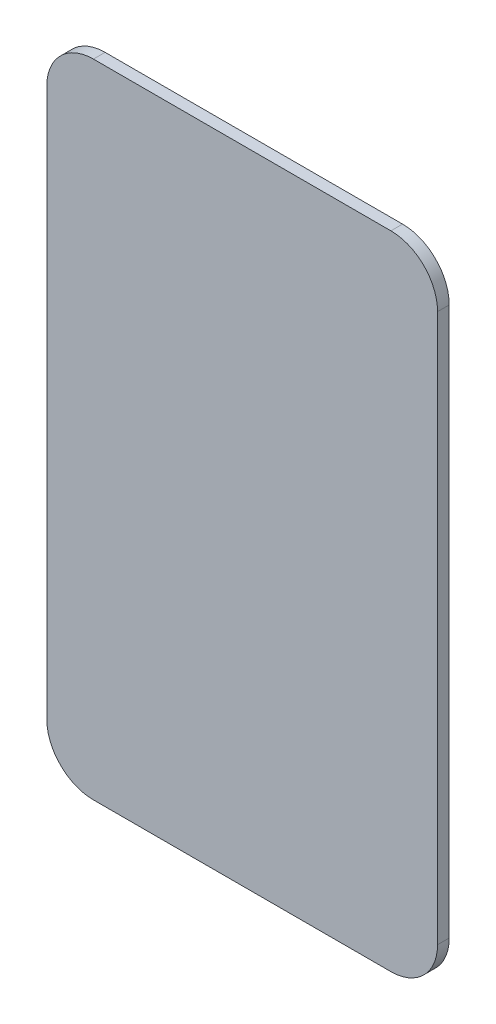
ISO-10303-21;
HEADER;
FILE_DESCRIPTION(('STEP AP214'),'2;1');
FILE_NAME('part.step','',(''),(''),'','','');
FILE_SCHEMA(('AUTOMOTIVE_DESIGN { 1 0 10303 214 1 1 1 1 }'));
ENDSEC;
DATA;
#1=APPLICATION_CONTEXT('core data for automotive mechanical design processes');
#2=APPLICATION_PROTOCOL_DEFINITION('international standard','automotive_design',2000,#1);
#3=PRODUCT_CONTEXT('',#1,'mechanical');
#4=PRODUCT('Part','Part','',(#3));
#5=PRODUCT_RELATED_PRODUCT_CATEGORY('part','',(#4));
#6=PRODUCT_DEFINITION_FORMATION('','',#4);
#7=PRODUCT_DEFINITION_CONTEXT('part definition',#1,'design');
#8=PRODUCT_DEFINITION('design','',#6,#7);
#9=PRODUCT_DEFINITION_SHAPE('','',#8);
#10=(LENGTH_UNIT() NAMED_UNIT(*) SI_UNIT(.MILLI.,.METRE.));
#11=(NAMED_UNIT(*) PLANE_ANGLE_UNIT() SI_UNIT($,.RADIAN.));
#12=(NAMED_UNIT(*) SI_UNIT($,.STERADIAN.) SOLID_ANGLE_UNIT());
#13=UNCERTAINTY_MEASURE_WITH_UNIT(LENGTH_MEASURE(1.E-05),#10,'distance_accuracy_value','');
#14=(GEOMETRIC_REPRESENTATION_CONTEXT(3) GLOBAL_UNCERTAINTY_ASSIGNED_CONTEXT((#13)) GLOBAL_UNIT_ASSIGNED_CONTEXT((#10,
#11,#12)) REPRESENTATION_CONTEXT('',''));
#15=CARTESIAN_POINT('',(0.,0.,0.));
#16=DIRECTION('',(0.,0.,1.));
#17=DIRECTION('',(1.,0.,0.));
#18=AXIS2_PLACEMENT_3D('',#15,#16,#17);
#19=CARTESIAN_POINT('',(812.8,1358.9,25.4));
#20=DIRECTION('',(0.,0.,-1.));
#21=DIRECTION('',(-1.,0.,0.));
#22=AXIS2_PLACEMENT_3D('',#19,#20,#21);
#23=CYLINDRICAL_SURFACE('',#22,101.6);
#24=CARTESIAN_POINT('',(812.8,1358.9,0.));
#25=DIRECTION('',(0.,0.,1.));
#26=DIRECTION('',(-1.,0.,0.));
#27=AXIS2_PLACEMENT_3D('',#24,#25,#26);
#28=CIRCLE('',#27,101.6);
#29=CARTESIAN_POINT('',(914.4,1358.9,0.));
#30=VERTEX_POINT('',#29);
#31=CARTESIAN_POINT('',(812.799999999999,1460.5,0.));
#32=VERTEX_POINT('',#31);
#33=EDGE_CURVE('E129',#30,#32,#28,.T.);
#34=ORIENTED_EDGE('',*,*,#33,.T.);
#35=DIRECTION('',(0.,0.,-1.));
#36=VECTOR('',#35,1.);
#37=CARTESIAN_POINT('',(812.799999999999,1460.5,25.4));
#38=LINE('',#37,#36);
#39=CARTESIAN_POINT('',(812.799999999999,1460.5,25.4));
#40=VERTEX_POINT('',#39);
#41=EDGE_CURVE('E11',#40,#32,#38,.T.);
#42=ORIENTED_EDGE('',*,*,#41,.F.);
#43=CARTESIAN_POINT('',(812.8,1358.9,25.4));
#44=DIRECTION('',(0.,0.,1.));
#45=DIRECTION('',(-1.,0.,0.));
#46=AXIS2_PLACEMENT_3D('',#43,#44,#45);
#47=CIRCLE('',#46,101.6);
#48=CARTESIAN_POINT('',(914.4,1358.9,25.4));
#49=VERTEX_POINT('',#48);
#50=EDGE_CURVE('E143',#49,#40,#47,.T.);
#51=ORIENTED_EDGE('',*,*,#50,.F.);
#52=DIRECTION('',(0.,0.,-1.));
#53=VECTOR('',#52,1.);
#54=CARTESIAN_POINT('',(914.4,1358.9,25.4));
#55=LINE('',#54,#53);
#56=EDGE_CURVE('E125',#49,#30,#55,.T.);
#57=ORIENTED_EDGE('',*,*,#56,.T.);
#58=EDGE_LOOP('',(#34,#42,#51,#57));
#59=FACE_BOUND('',#58,.T.);
#60=ADVANCED_FACE('F33',(#59),#23,.T.);
#61=CARTESIAN_POINT('',(165.100000000001,1460.5,25.4));
#62=DIRECTION('',(0.,-1.,0.));
#63=DIRECTION('',(0.,0.,-1.));
#64=AXIS2_PLACEMENT_3D('',#61,#62,#63);
#65=PLANE('',#64);
#66=DIRECTION('',(-1.,0.,0.));
#67=VECTOR('',#66,1.);
#68=CARTESIAN_POINT('',(165.100000000001,1460.5,0.));
#69=LINE('',#68,#67);
#70=CARTESIAN_POINT('',(165.100000000001,1460.5,0.));
#71=VERTEX_POINT('',#70);
#72=EDGE_CURVE('E132',#32,#71,#69,.T.);
#73=ORIENTED_EDGE('',*,*,#72,.T.);
#74=DIRECTION('',(0.,0.,-1.));
#75=VECTOR('',#74,1.);
#76=CARTESIAN_POINT('',(165.100000000001,1460.5,25.4));
#77=LINE('',#76,#75);
#78=CARTESIAN_POINT('',(165.100000000001,1460.5,25.4));
#79=VERTEX_POINT('',#78);
#80=EDGE_CURVE('E41',#79,#71,#77,.T.);
#81=ORIENTED_EDGE('',*,*,#80,.F.);
#82=DIRECTION('',(-1.,0.,0.));
#83=VECTOR('',#82,1.);
#84=CARTESIAN_POINT('',(165.100000000001,1460.5,25.4));
#85=LINE('',#84,#83);
#86=EDGE_CURVE('E92',#40,#79,#85,.T.);
#87=ORIENTED_EDGE('',*,*,#86,.F.);
#88=ORIENTED_EDGE('',*,*,#41,.T.);
#89=EDGE_LOOP('',(#73,#81,#87,#88));
#90=FACE_BOUND('',#89,.T.);
#91=ADVANCED_FACE('F178',(#90),#65,.F.);
#92=CARTESIAN_POINT('',(165.1,1358.9,25.4));
#93=DIRECTION('',(0.,0.,-1.));
#94=DIRECTION('',(-1.,0.,0.));
#95=AXIS2_PLACEMENT_3D('',#92,#93,#94);
#96=CYLINDRICAL_SURFACE('',#95,101.6);
#97=CARTESIAN_POINT('',(165.1,1358.9,0.));
#98=DIRECTION('',(0.,0.,1.));
#99=DIRECTION('',(-1.,0.,0.));
#100=AXIS2_PLACEMENT_3D('',#97,#98,#99);
#101=CIRCLE('',#100,101.6);
#102=CARTESIAN_POINT('',(63.5,1358.9,0.));
#103=VERTEX_POINT('',#102);
#104=EDGE_CURVE('E134',#71,#103,#101,.T.);
#105=ORIENTED_EDGE('',*,*,#104,.T.);
#106=DIRECTION('',(0.,0.,-1.));
#107=VECTOR('',#106,1.);
#108=CARTESIAN_POINT('',(63.5,1358.9,25.4));
#109=LINE('',#108,#107);
#110=CARTESIAN_POINT('',(63.5,1358.9,25.4));
#111=VERTEX_POINT('',#110);
#112=EDGE_CURVE('E150',#111,#103,#109,.T.);
#113=ORIENTED_EDGE('',*,*,#112,.F.);
#114=CARTESIAN_POINT('',(165.1,1358.9,25.4));
#115=DIRECTION('',(0.,0.,1.));
#116=DIRECTION('',(-1.,0.,0.));
#117=AXIS2_PLACEMENT_3D('',#114,#115,#116);
#118=CIRCLE('',#117,101.6);
#119=EDGE_CURVE('E158',#79,#111,#118,.T.);
#120=ORIENTED_EDGE('',*,*,#119,.F.);
#121=ORIENTED_EDGE('',*,*,#80,.T.);
#122=EDGE_LOOP('',(#105,#113,#120,#121));
#123=FACE_BOUND('',#122,.T.);
#124=ADVANCED_FACE('F156',(#123),#96,.T.);
#125=CARTESIAN_POINT('',(63.5,165.100000000001,25.4));
#126=DIRECTION('',(1.,0.,0.));
#127=DIRECTION('',(0.,0.,-1.));
#128=AXIS2_PLACEMENT_3D('',#125,#126,#127);
#129=PLANE('',#128);
#130=DIRECTION('',(0.,-1.,0.));
#131=VECTOR('',#130,1.);
#132=CARTESIAN_POINT('',(63.5,165.100000000001,0.));
#133=LINE('',#132,#131);
#134=CARTESIAN_POINT('',(63.5,165.100000000001,0.));
#135=VERTEX_POINT('',#134);
#136=EDGE_CURVE('E136',#103,#135,#133,.T.);
#137=ORIENTED_EDGE('',*,*,#136,.T.);
#138=DIRECTION('',(0.,0.,-1.));
#139=VECTOR('',#138,1.);
#140=CARTESIAN_POINT('',(63.5,165.100000000001,25.4));
#141=LINE('',#140,#139);
#142=CARTESIAN_POINT('',(63.5,165.100000000001,25.4));
#143=VERTEX_POINT('',#142);
#144=EDGE_CURVE('E147',#143,#135,#141,.T.);
#145=ORIENTED_EDGE('',*,*,#144,.F.);
#146=DIRECTION('',(0.,-1.,0.));
#147=VECTOR('',#146,1.);
#148=CARTESIAN_POINT('',(63.5,165.100000000001,25.4));
#149=LINE('',#148,#147);
#150=EDGE_CURVE('E170',#111,#143,#149,.T.);
#151=ORIENTED_EDGE('',*,*,#150,.F.);
#152=ORIENTED_EDGE('',*,*,#112,.T.);
#153=EDGE_LOOP('',(#137,#145,#151,#152));
#154=FACE_BOUND('',#153,.T.);
#155=ADVANCED_FACE('F166',(#154),#129,.F.);
#156=CARTESIAN_POINT('',(165.1,165.1,25.4));
#157=DIRECTION('',(0.,0.,-1.));
#158=DIRECTION('',(-1.,0.,0.));
#159=AXIS2_PLACEMENT_3D('',#156,#157,#158);
#160=CYLINDRICAL_SURFACE('',#159,101.6);
#161=CARTESIAN_POINT('',(165.1,165.1,0.));
#162=DIRECTION('',(0.,0.,1.));
#163=DIRECTION('',(1.,0.,0.));
#164=AXIS2_PLACEMENT_3D('',#161,#162,#163);
#165=CIRCLE('',#164,101.6);
#166=CARTESIAN_POINT('',(165.100000000001,63.5,0.));
#167=VERTEX_POINT('',#166);
#168=EDGE_CURVE('E138',#135,#167,#165,.T.);
#169=ORIENTED_EDGE('',*,*,#168,.T.);
#170=DIRECTION('',(0.,0.,-1.));
#171=VECTOR('',#170,1.);
#172=CARTESIAN_POINT('',(165.100000000001,63.5,25.4));
#173=LINE('',#172,#171);
#174=CARTESIAN_POINT('',(165.100000000001,63.5,25.4));
#175=VERTEX_POINT('',#174);
#176=EDGE_CURVE('E120',#175,#167,#173,.T.);
#177=ORIENTED_EDGE('',*,*,#176,.F.);
#178=CARTESIAN_POINT('',(165.1,165.1,25.4));
#179=DIRECTION('',(0.,0.,1.));
#180=DIRECTION('',(1.,0.,0.));
#181=AXIS2_PLACEMENT_3D('',#178,#179,#180);
#182=CIRCLE('',#181,101.6);
#183=EDGE_CURVE('E111',#143,#175,#182,.T.);
#184=ORIENTED_EDGE('',*,*,#183,.F.);
#185=ORIENTED_EDGE('',*,*,#144,.T.);
#186=EDGE_LOOP('',(#169,#177,#184,#185));
#187=FACE_BOUND('',#186,.T.);
#188=ADVANCED_FACE('F169',(#187),#160,.T.);
#189=CARTESIAN_POINT('',(165.100000000001,63.5,25.4));
#190=DIRECTION('',(0.,1.,0.));
#191=DIRECTION('',(0.,0.,1.));
#192=AXIS2_PLACEMENT_3D('',#189,#190,#191);
#193=PLANE('',#192);
#194=DIRECTION('',(1.,0.,0.));
#195=VECTOR('',#194,1.);
#196=CARTESIAN_POINT('',(165.100000000001,63.5,0.));
#197=LINE('',#196,#195);
#198=CARTESIAN_POINT('',(812.799999999999,63.5,0.));
#199=VERTEX_POINT('',#198);
#200=EDGE_CURVE('E119',#167,#199,#197,.T.);
#201=ORIENTED_EDGE('',*,*,#200,.T.);
#202=DIRECTION('',(0.,0.,-1.));
#203=VECTOR('',#202,1.);
#204=CARTESIAN_POINT('',(812.799999999999,63.5,25.4));
#205=LINE('',#204,#203);
#206=CARTESIAN_POINT('',(812.799999999999,63.5,25.4));
#207=VERTEX_POINT('',#206);
#208=EDGE_CURVE('E116',#207,#199,#205,.T.);
#209=ORIENTED_EDGE('',*,*,#208,.F.);
#210=DIRECTION('',(1.,0.,0.));
#211=VECTOR('',#210,1.);
#212=CARTESIAN_POINT('',(165.100000000001,63.5,25.4));
#213=LINE('',#212,#211);
#214=EDGE_CURVE('E105',#175,#207,#213,.T.);
#215=ORIENTED_EDGE('',*,*,#214,.F.);
#216=ORIENTED_EDGE('',*,*,#176,.T.);
#217=EDGE_LOOP('',(#201,#209,#215,#216));
#218=FACE_BOUND('',#217,.T.);
#219=ADVANCED_FACE('F117',(#218),#193,.F.);
#220=CARTESIAN_POINT('',(812.8,165.1,25.4));
#221=DIRECTION('',(0.,0.,-1.));
#222=DIRECTION('',(-1.,0.,0.));
#223=AXIS2_PLACEMENT_3D('',#220,#221,#222);
#224=CYLINDRICAL_SURFACE('',#223,101.6);
#225=CARTESIAN_POINT('',(812.8,165.1,0.));
#226=DIRECTION('',(0.,0.,1.));
#227=DIRECTION('',(-1.,0.,0.));
#228=AXIS2_PLACEMENT_3D('',#225,#226,#227);
#229=CIRCLE('',#228,101.6);
#230=CARTESIAN_POINT('',(914.4,165.100000000001,0.));
#231=VERTEX_POINT('',#230);
#232=EDGE_CURVE('E78',#199,#231,#229,.T.);
#233=ORIENTED_EDGE('',*,*,#232,.T.);
#234=DIRECTION('',(0.,0.,-1.));
#235=VECTOR('',#234,1.);
#236=CARTESIAN_POINT('',(914.4,165.100000000001,25.4));
#237=LINE('',#236,#235);
#238=CARTESIAN_POINT('',(914.4,165.100000000001,25.4));
#239=VERTEX_POINT('',#238);
#240=EDGE_CURVE('E121',#239,#231,#237,.T.);
#241=ORIENTED_EDGE('',*,*,#240,.F.);
#242=CARTESIAN_POINT('',(812.8,165.1,25.4));
#243=DIRECTION('',(0.,0.,1.));
#244=DIRECTION('',(-1.,0.,0.));
#245=AXIS2_PLACEMENT_3D('',#242,#243,#244);
#246=CIRCLE('',#245,101.6);
#247=EDGE_CURVE('E109',#207,#239,#246,.T.);
#248=ORIENTED_EDGE('',*,*,#247,.F.);
#249=ORIENTED_EDGE('',*,*,#208,.T.);
#250=EDGE_LOOP('',(#233,#241,#248,#249));
#251=FACE_BOUND('',#250,.T.);
#252=ADVANCED_FACE('F123',(#251),#224,.T.);
#253=CARTESIAN_POINT('',(914.4,165.100000000001,25.4));
#254=DIRECTION('',(-1.,0.,0.));
#255=DIRECTION('',(0.,0.,1.));
#256=AXIS2_PLACEMENT_3D('',#253,#254,#255);
#257=PLANE('',#256);
#258=DIRECTION('',(0.,1.,0.));
#259=VECTOR('',#258,1.);
#260=CARTESIAN_POINT('',(914.4,165.100000000001,0.));
#261=LINE('',#260,#259);
#262=EDGE_CURVE('E84',#231,#30,#261,.T.);
#263=ORIENTED_EDGE('',*,*,#262,.T.);
#264=ORIENTED_EDGE('',*,*,#56,.F.);
#265=DIRECTION('',(0.,1.,0.));
#266=VECTOR('',#265,1.);
#267=CARTESIAN_POINT('',(914.4,165.100000000001,25.4));
#268=LINE('',#267,#266);
#269=EDGE_CURVE('E49',#239,#49,#268,.T.);
#270=ORIENTED_EDGE('',*,*,#269,.F.);
#271=ORIENTED_EDGE('',*,*,#240,.T.);
#272=EDGE_LOOP('',(#263,#264,#270,#271));
#273=FACE_BOUND('',#272,.T.);
#274=ADVANCED_FACE('F194',(#273),#257,.F.);
#275=CARTESIAN_POINT('',(812.8,1358.9,25.4));
#276=DIRECTION('',(0.,0.,-1.));
#277=DIRECTION('',(-1.,0.,0.));
#278=AXIS2_PLACEMENT_3D('',#275,#276,#277);
#279=PLANE('',#278);
#280=ORIENTED_EDGE('',*,*,#50,.T.);
#281=ORIENTED_EDGE('',*,*,#86,.T.);
#282=ORIENTED_EDGE('',*,*,#119,.T.);
#283=ORIENTED_EDGE('',*,*,#150,.T.);
#284=ORIENTED_EDGE('',*,*,#183,.T.);
#285=ORIENTED_EDGE('',*,*,#214,.T.);
#286=ORIENTED_EDGE('',*,*,#247,.T.);
#287=ORIENTED_EDGE('',*,*,#269,.T.);
#288=EDGE_LOOP('',(#280,#281,#282,#283,#284,#285,#286,#287));
#289=FACE_BOUND('',#288,.T.);
#290=ADVANCED_FACE('F107',(#289),#279,.F.);
#291=CARTESIAN_POINT('',(812.8,1358.9,0.));
#292=DIRECTION('',(0.,0.,-1.));
#293=DIRECTION('',(-1.,0.,0.));
#294=AXIS2_PLACEMENT_3D('',#291,#292,#293);
#295=PLANE('',#294);
#296=ORIENTED_EDGE('',*,*,#33,.F.);
#297=ORIENTED_EDGE('',*,*,#262,.F.);
#298=ORIENTED_EDGE('',*,*,#232,.F.);
#299=ORIENTED_EDGE('',*,*,#200,.F.);
#300=ORIENTED_EDGE('',*,*,#168,.F.);
#301=ORIENTED_EDGE('',*,*,#136,.F.);
#302=ORIENTED_EDGE('',*,*,#104,.F.);
#303=ORIENTED_EDGE('',*,*,#72,.F.);
#304=EDGE_LOOP('',(#296,#297,#298,#299,#300,#301,#302,#303));
#305=FACE_BOUND('',#304,.T.);
#306=ADVANCED_FACE('F162',(#305),#295,.T.);
#307=CLOSED_SHELL('',(#60,#91,#124,#155,#188,#219,#252,#274,#290,#306));
#308=MANIFOLD_SOLID_BREP('B2',#307);
#309=ADVANCED_BREP_SHAPE_REPRESENTATION('',(#18,#308),#14);
#310=SHAPE_DEFINITION_REPRESENTATION(#9,#309);
ENDSEC;
END-ISO-10303-21;
